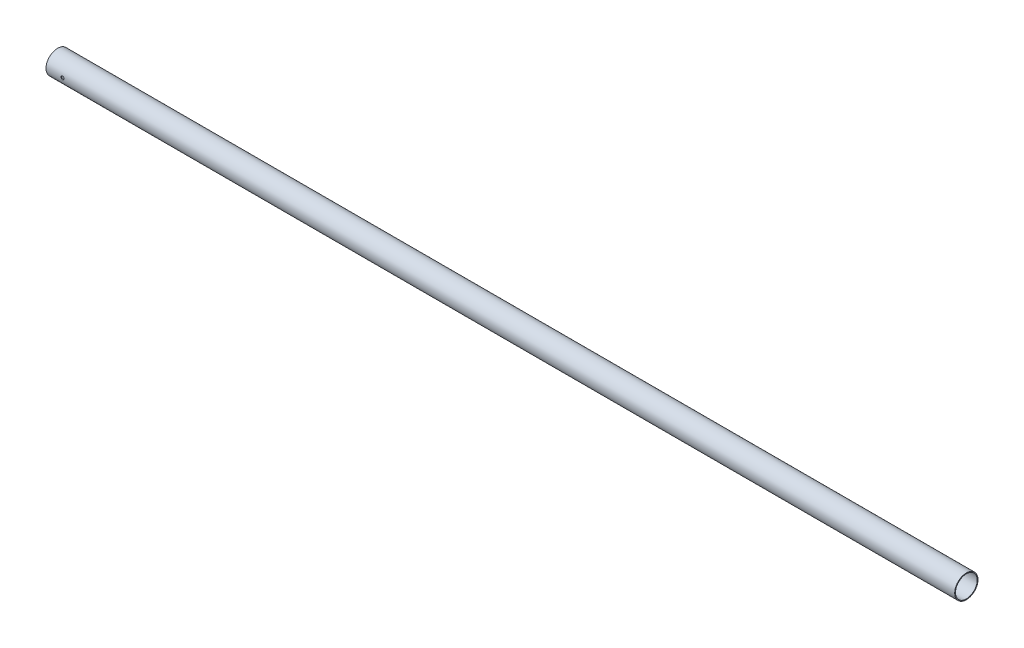
ISO-10303-21;
HEADER;
FILE_DESCRIPTION(('STEP AP214'),'2;1');
FILE_NAME('part.step','',(''),(''),'','','');
FILE_SCHEMA(('AUTOMOTIVE_DESIGN { 1 0 10303 214 1 1 1 1 }'));
ENDSEC;
DATA;
#1=APPLICATION_CONTEXT('core data for automotive mechanical design processes');
#2=APPLICATION_PROTOCOL_DEFINITION('international standard','automotive_design',2000,#1);
#3=PRODUCT_CONTEXT('',#1,'mechanical');
#4=PRODUCT('Part','Part','',(#3));
#5=PRODUCT_RELATED_PRODUCT_CATEGORY('part','',(#4));
#6=PRODUCT_DEFINITION_FORMATION('','',#4);
#7=PRODUCT_DEFINITION_CONTEXT('part definition',#1,'design');
#8=PRODUCT_DEFINITION('design','',#6,#7);
#9=PRODUCT_DEFINITION_SHAPE('','',#8);
#10=(LENGTH_UNIT() NAMED_UNIT(*) SI_UNIT(.MILLI.,.METRE.));
#11=(NAMED_UNIT(*) PLANE_ANGLE_UNIT() SI_UNIT($,.RADIAN.));
#12=(NAMED_UNIT(*) SI_UNIT($,.STERADIAN.) SOLID_ANGLE_UNIT());
#13=UNCERTAINTY_MEASURE_WITH_UNIT(LENGTH_MEASURE(1.E-05),#10,'distance_accuracy_value','');
#14=(GEOMETRIC_REPRESENTATION_CONTEXT(3) GLOBAL_UNCERTAINTY_ASSIGNED_CONTEXT((#13)) GLOBAL_UNIT_ASSIGNED_CONTEXT((#10,
#11,#12)) REPRESENTATION_CONTEXT('',''));
#15=CARTESIAN_POINT('',(0.,0.,0.));
#16=DIRECTION('',(0.,0.,1.));
#17=DIRECTION('',(1.,0.,0.));
#18=AXIS2_PLACEMENT_3D('',#15,#16,#17);
#19=CARTESIAN_POINT('',(991.014,0.,0.));
#20=DIRECTION('',(1.,0.,0.));
#21=DIRECTION('',(0.,0.,-1.));
#22=AXIS2_PLACEMENT_3D('',#19,#20,#21);
#23=PLANE('',#22);
#24=CARTESIAN_POINT('',(991.014,0.,0.));
#25=DIRECTION('',(1.,0.,0.));
#26=DIRECTION('',(0.,0.,-1.));
#27=AXIS2_PLACEMENT_3D('',#24,#25,#26);
#28=CIRCLE('',#27,12.7);
#29=CARTESIAN_POINT('',(991.014,0.,-12.7));
#30=VERTEX_POINT('',#29);
#31=EDGE_CURVE('E10',#30,#30,#28,.T.);
#32=ORIENTED_EDGE('',*,*,#31,.T.);
#33=EDGE_LOOP('',(#32));
#34=FACE_BOUND('',#33,.T.);
#35=CARTESIAN_POINT('',(991.014,0.,0.));
#36=DIRECTION('',(1.,0.,0.));
#37=DIRECTION('',(0.,0.,-1.));
#38=AXIS2_PLACEMENT_3D('',#35,#36,#37);
#39=CIRCLE('',#38,11.811);
#40=CARTESIAN_POINT('',(991.014,0.,-11.811));
#41=VERTEX_POINT('',#40);
#42=EDGE_CURVE('E56',#41,#41,#39,.T.);
#43=ORIENTED_EDGE('',*,*,#42,.F.);
#44=EDGE_LOOP('',(#43));
#45=FACE_BOUND('',#44,.T.);
#46=ADVANCED_FACE('F37',(#34,#45),#23,.T.);
#47=CARTESIAN_POINT('',(0.,0.,0.));
#48=DIRECTION('',(1.,0.,0.));
#49=DIRECTION('',(0.,0.,-1.));
#50=AXIS2_PLACEMENT_3D('',#47,#48,#49);
#51=PLANE('',#50);
#52=CARTESIAN_POINT('',(0.,0.,0.));
#53=DIRECTION('',(1.,0.,0.));
#54=DIRECTION('',(0.,0.,-1.));
#55=AXIS2_PLACEMENT_3D('',#52,#53,#54);
#56=CIRCLE('',#55,12.7);
#57=CARTESIAN_POINT('',(0.,0.,-12.7));
#58=VERTEX_POINT('',#57);
#59=EDGE_CURVE('E51',#58,#58,#56,.T.);
#60=ORIENTED_EDGE('',*,*,#59,.F.);
#61=EDGE_LOOP('',(#60));
#62=FACE_BOUND('',#61,.T.);
#63=CARTESIAN_POINT('',(0.,0.,0.));
#64=DIRECTION('',(1.,0.,0.));
#65=DIRECTION('',(0.,0.,-1.));
#66=AXIS2_PLACEMENT_3D('',#63,#64,#65);
#67=CIRCLE('',#66,11.811);
#68=CARTESIAN_POINT('',(0.,0.,-11.811));
#69=VERTEX_POINT('',#68);
#70=EDGE_CURVE('E59',#69,#69,#67,.T.);
#71=ORIENTED_EDGE('',*,*,#70,.T.);
#72=EDGE_LOOP('',(#71));
#73=FACE_BOUND('',#72,.T.);
#74=ADVANCED_FACE('F95',(#62,#73),#51,.F.);
#75=CARTESIAN_POINT('',(991.014,0.,0.));
#76=DIRECTION('',(-1.,0.,0.));
#77=DIRECTION('',(0.,0.,1.));
#78=AXIS2_PLACEMENT_3D('',#75,#76,#77);
#79=CYLINDRICAL_SURFACE('',#78,12.7);
#80=CARTESIAN_POINT('',(19.7,0.,-12.7));
#81=CARTESIAN_POINT('',(19.6999959992179,0.0950339668840666,-12.6999985995786));
#82=CARTESIAN_POINT('',(19.6920041882555,0.19012590693117,-12.69892205577));
#83=CARTESIAN_POINT('',(19.6602516928035,0.377659735515664,-12.6947310786922));
#84=CARTESIAN_POINT('',(19.6364749137547,0.470098818704447,-12.6916145654891));
#85=CARTESIAN_POINT('',(19.5738689603469,0.649585162895937,-12.6836944529743));
#86=CARTESIAN_POINT('',(19.5350503362114,0.736636153540407,-12.6788920363625));
#87=CARTESIAN_POINT('',(19.4434866282167,0.902972809326937,-12.668133083874));
#88=CARTESIAN_POINT('',(19.3907437804094,0.98225971848077,-12.6621767333452));
#89=CARTESIAN_POINT('',(19.2724752538047,1.13133074623819,-12.6497322350832));
#90=CARTESIAN_POINT('',(19.2068795471188,1.20105907920494,-12.6432412923369));
#91=CARTESIAN_POINT('',(19.0649178381758,1.32855287527093,-12.6304814917944));
#92=CARTESIAN_POINT('',(18.9885512647912,1.38631770360164,-12.6242126457971));
#93=CARTESIAN_POINT('',(18.8268487301552,1.48845585085959,-12.6125794864754));
#94=CARTESIAN_POINT('',(18.7414790965265,1.53277630674079,-12.6072187794791));
#95=CARTESIAN_POINT('',(18.5644244545483,1.60642994888796,-12.5980462279763));
#96=CARTESIAN_POINT('',(18.4727397204773,1.63576378559042,-12.5942343162519));
#97=CARTESIAN_POINT('',(18.2862392993217,1.67844067068208,-12.5886179602665));
#98=CARTESIAN_POINT('',(18.19144564102,1.69187839487359,-12.5868016351371));
#99=CARTESIAN_POINT('',(18.0009326732876,1.70267468090193,-12.5853458584028));
#100=CARTESIAN_POINT('',(17.9052134065726,1.70003398123825,-12.5857063068164));
#101=CARTESIAN_POINT('',(17.7162291334578,1.67882597900675,-12.5885524791077));
#102=CARTESIAN_POINT('',(17.6229521402506,1.66036334859318,-12.591024234991));
#103=CARTESIAN_POINT('',(17.4408322087313,1.60819906549934,-12.5977927233188));
#104=CARTESIAN_POINT('',(17.3519893722998,1.57449706285331,-12.6020894976741));
#105=CARTESIAN_POINT('',(17.180936742358,1.4926994268841,-12.6120395901206));
#106=CARTESIAN_POINT('',(17.0987487727502,1.44455869286377,-12.6176971476118));
#107=CARTESIAN_POINT('',(16.9435781710446,1.33528234667655,-12.6297281429156));
#108=CARTESIAN_POINT('',(16.8705960216702,1.27414605351568,-12.6361016182354));
#109=CARTESIAN_POINT('',(16.7353015027677,1.14003577368446,-12.6489082931571));
#110=CARTESIAN_POINT('',(16.673078463414,1.06697163981454,-12.655341565124));
#111=CARTESIAN_POINT('',(16.5617652939802,0.911389033566232,-12.6674957373912));
#112=CARTESIAN_POINT('',(16.5126752022542,0.828870533577836,-12.6732166356108));
#113=CARTESIAN_POINT('',(16.4290198450538,0.656649852468908,-12.6833057832175));
#114=CARTESIAN_POINT('',(16.3944606061958,0.566944709042034,-12.6876734711684));
#115=CARTESIAN_POINT('',(16.3409211232213,0.382932939657379,-12.6945591425037));
#116=CARTESIAN_POINT('',(16.3219400419676,0.288626561248753,-12.6970772252812));
#117=CARTESIAN_POINT('',(16.3002124588233,0.0988612499416711,-12.6999669678248));
#118=CARTESIAN_POINT('',(16.2973429834856,0.00341663518550021,-12.7003548857848));
#119=CARTESIAN_POINT('',(16.3075949092041,-0.186592199942903,-12.6989846078418));
#120=CARTESIAN_POINT('',(16.3207159184645,-0.281156441828657,-12.6972264645213));
#121=CARTESIAN_POINT('',(16.3624741566565,-0.466354124240493,-12.6917717046385));
#122=CARTESIAN_POINT('',(16.3910523228938,-0.557001118115943,-12.688082468612));
#123=CARTESIAN_POINT('',(16.4628519475053,-0.73221634230603,-12.6791782889493));
#124=CARTESIAN_POINT('',(16.5060739685466,-0.816784338893335,-12.6739632866891));
#125=CARTESIAN_POINT('',(16.6062288937945,-0.977987387725022,-12.6625478144558));
#126=CARTESIAN_POINT('',(16.6632408321252,-1.05457293223038,-12.6563417366426));
#127=CARTESIAN_POINT('',(16.7892460195627,-1.19713236803618,-12.6436547701942));
#128=CARTESIAN_POINT('',(16.8582398170769,-1.26310577335476,-12.6371738689908));
#129=CARTESIAN_POINT('',(17.006793907203,-1.38300824178855,-12.6246170593813));
#130=CARTESIAN_POINT('',(17.0864205322927,-1.43685547455966,-12.6185440858799));
#131=CARTESIAN_POINT('',(17.2536601808562,-1.53041060066335,-12.607540272347));
#132=CARTESIAN_POINT('',(17.3412730247706,-1.57011881179429,-12.6026094066456));
#133=CARTESIAN_POINT('',(17.5217407781579,-1.63413811770883,-12.5944685488549));
#134=CARTESIAN_POINT('',(17.6145794495971,-1.65849431867464,-12.5912535197242));
#135=CARTESIAN_POINT('',(17.8030751011367,-1.69126295280576,-12.5868942723901));
#136=CARTESIAN_POINT('',(17.8987319289187,-1.69967624606926,-12.5857499424755));
#137=CARTESIAN_POINT('',(18.0893339863174,-1.70030289341542,-12.5856652315807));
#138=CARTESIAN_POINT('',(18.1842788108431,-1.69264483293011,-12.5867073569543));
#139=CARTESIAN_POINT('',(18.3715183834309,-1.66161953930401,-12.5908403897388));
#140=CARTESIAN_POINT('',(18.463813132574,-1.6382523125708,-12.593931296314));
#141=CARTESIAN_POINT('',(18.6431094231047,-1.57651400196732,-12.601807977421));
#142=CARTESIAN_POINT('',(18.7301134601321,-1.53815005652329,-12.6065929454788));
#143=CARTESIAN_POINT('',(18.8964702488958,-1.44751995832389,-12.6173198076024));
#144=CARTESIAN_POINT('',(18.9758228494986,-1.39525353103899,-12.6232617245136));
#145=CARTESIAN_POINT('',(19.1252803268485,-1.27782820548912,-12.6356898389152));
#146=CARTESIAN_POINT('',(19.1953097247303,-1.21257363471889,-12.6421798563099));
#147=CARTESIAN_POINT('',(19.3234721297044,-1.07122538659935,-12.6549397826002));
#148=CARTESIAN_POINT('',(19.3816023430478,-0.995129170891949,-12.6612096395197));
#149=CARTESIAN_POINT('',(19.48453599194,-0.833873629090083,-12.6728533752327));
#150=CARTESIAN_POINT('',(19.5292802962862,-0.748676282109283,-12.6782232337741));
#151=CARTESIAN_POINT('',(19.6037608892282,-0.571949691102355,-12.6874217828558));
#152=CARTESIAN_POINT('',(19.63351323197,-0.48042734019212,-12.6912521210983));
#153=CARTESIAN_POINT('',(19.6701668573837,-0.32370968364222,-12.6960329483211));
#154=CARTESIAN_POINT('',(19.6813378724772,-0.259496143043121,-12.6975132154494));
#155=CARTESIAN_POINT('',(19.6962557812401,-0.130197467850004,-12.6994972166818));
#156=CARTESIAN_POINT('',(19.7000027411282,-0.0651123410353023,-12.700000959496));
#157=CARTESIAN_POINT('',(19.7,0.,-12.7));
#158=B_SPLINE_CURVE_WITH_KNOTS('',3,(#80,#81,#82,#83,#84,#85,#86,#87,#88,#89,#90,#91,#92,#93,
#94,#95,#96,#97,#98,#99,#100,#101,#102,#103,#104,#105,#106,#107,#108,#109,#110,#111,#112,#113,
#114,#115,#116,#117,#118,#119,#120,#121,#122,#123,#124,#125,#126,#127,#128,#129,#130,#131,#132,
#133,#134,#135,#136,#137,#138,#139,#140,#141,#142,#143,#144,#145,#146,#147,#148,#149,#150,#151,
#152,#153,#154,#155,#156,#157),.UNSPECIFIED.,.T.,.F.,(4,2,2,2,2,2,2,2,2,2,2,2,2,2,2,2,2,2,2,2,2,
2,2,2,2,2,2,2,2,2,2,2,2,2,2,2,2,2,4),(0.,0.284864035698537,0.570018969485685,0.854974258980744,
1.13988381611715,1.42639115813427,1.71291369797885,2.00054865692536,2.28817113112365,
2.57407178612564,2.85995930949888,3.14396997780514,3.42798716862777,3.71290091962872,
3.99782960437716,4.28502088941334,4.57221301316844,4.85952413156251,5.14681980945722,
5.43191966224501,5.71701252971187,6.00102365831222,6.28504570083371,6.57073582475008,
6.8564390280948,7.14401601038438,7.431586528488,7.71830813986012,8.0050142825509,
8.28943526420126,8.57385612983972,8.85814177590334,9.14243303611576,9.42890156631939,
9.71543727805735,10.0032206578249,10.290695206261,10.4858709975236,10.6810450479105),.UNSPECIFIED.);
#159=CARTESIAN_POINT('',(19.7,0.,-12.7));
#160=VERTEX_POINT('',#159);
#161=EDGE_CURVE('E84',#160,#160,#158,.T.);
#162=ORIENTED_EDGE('',*,*,#161,.T.);
#163=EDGE_LOOP('',(#162));
#164=FACE_BOUND('',#163,.T.);
#165=CARTESIAN_POINT('',(19.7,0.,12.7));
#166=CARTESIAN_POINT('',(19.6999959992179,-0.0950339668840666,12.6999985995786));
#167=CARTESIAN_POINT('',(19.6920041882555,-0.19012590693117,12.69892205577));
#168=CARTESIAN_POINT('',(19.6602516928035,-0.377659735515664,12.6947310786922));
#169=CARTESIAN_POINT('',(19.6364749137547,-0.470098818704447,12.6916145654891));
#170=CARTESIAN_POINT('',(19.5738689603469,-0.649585162895937,12.6836944529743));
#171=CARTESIAN_POINT('',(19.5350503362114,-0.736636153540407,12.6788920363625));
#172=CARTESIAN_POINT('',(19.4434866282167,-0.902972809326937,12.668133083874));
#173=CARTESIAN_POINT('',(19.3907437804094,-0.98225971848077,12.6621767333452));
#174=CARTESIAN_POINT('',(19.2724752538047,-1.13133074623819,12.6497322350832));
#175=CARTESIAN_POINT('',(19.2068795471188,-1.20105907920494,12.6432412923369));
#176=CARTESIAN_POINT('',(19.0649178381758,-1.32855287527093,12.6304814917944));
#177=CARTESIAN_POINT('',(18.9885512647912,-1.38631770360164,12.6242126457971));
#178=CARTESIAN_POINT('',(18.8268487301552,-1.48845585085959,12.6125794864754));
#179=CARTESIAN_POINT('',(18.7414790965265,-1.53277630674079,12.6072187794791));
#180=CARTESIAN_POINT('',(18.5644244545483,-1.60642994888796,12.5980462279763));
#181=CARTESIAN_POINT('',(18.4727397204773,-1.63576378559042,12.5942343162519));
#182=CARTESIAN_POINT('',(18.2862392993217,-1.67844067068208,12.5886179602665));
#183=CARTESIAN_POINT('',(18.19144564102,-1.69187839487359,12.5868016351371));
#184=CARTESIAN_POINT('',(18.0009326732876,-1.70267468090193,12.5853458584028));
#185=CARTESIAN_POINT('',(17.9052134065726,-1.70003398123825,12.5857063068164));
#186=CARTESIAN_POINT('',(17.7162291334578,-1.67882597900675,12.5885524791077));
#187=CARTESIAN_POINT('',(17.6229521402506,-1.66036334859318,12.591024234991));
#188=CARTESIAN_POINT('',(17.4408322087313,-1.60819906549934,12.5977927233188));
#189=CARTESIAN_POINT('',(17.3519893722998,-1.57449706285331,12.6020894976741));
#190=CARTESIAN_POINT('',(17.180936742358,-1.4926994268841,12.6120395901206));
#191=CARTESIAN_POINT('',(17.0987487727502,-1.44455869286377,12.6176971476118));
#192=CARTESIAN_POINT('',(16.9435781710446,-1.33528234667655,12.6297281429156));
#193=CARTESIAN_POINT('',(16.8705960216702,-1.27414605351568,12.6361016182354));
#194=CARTESIAN_POINT('',(16.7353015027677,-1.14003577368446,12.6489082931571));
#195=CARTESIAN_POINT('',(16.673078463414,-1.06697163981454,12.655341565124));
#196=CARTESIAN_POINT('',(16.5617652939802,-0.911389033566232,12.6674957373912));
#197=CARTESIAN_POINT('',(16.5126752022542,-0.828870533577836,12.6732166356108));
#198=CARTESIAN_POINT('',(16.4290198450538,-0.656649852468908,12.6833057832175));
#199=CARTESIAN_POINT('',(16.3944606061958,-0.566944709042034,12.6876734711684));
#200=CARTESIAN_POINT('',(16.3409211232213,-0.382932939657379,12.6945591425037));
#201=CARTESIAN_POINT('',(16.3219400419676,-0.288626561248753,12.6970772252812));
#202=CARTESIAN_POINT('',(16.3002124588233,-0.0988612499416711,12.6999669678248));
#203=CARTESIAN_POINT('',(16.2973429834856,-0.00341663518550021,12.7003548857848));
#204=CARTESIAN_POINT('',(16.3075949092041,0.186592199942903,12.6989846078418));
#205=CARTESIAN_POINT('',(16.3207159184645,0.281156441828657,12.6972264645213));
#206=CARTESIAN_POINT('',(16.3624741566565,0.466354124240493,12.6917717046385));
#207=CARTESIAN_POINT('',(16.3910523228938,0.557001118115943,12.688082468612));
#208=CARTESIAN_POINT('',(16.4628519475053,0.73221634230603,12.6791782889493));
#209=CARTESIAN_POINT('',(16.5060739685466,0.816784338893335,12.6739632866891));
#210=CARTESIAN_POINT('',(16.6062288937945,0.977987387725022,12.6625478144558));
#211=CARTESIAN_POINT('',(16.6632408321252,1.05457293223038,12.6563417366426));
#212=CARTESIAN_POINT('',(16.7892460195627,1.19713236803618,12.6436547701942));
#213=CARTESIAN_POINT('',(16.8582398170769,1.26310577335476,12.6371738689908));
#214=CARTESIAN_POINT('',(17.006793907203,1.38300824178855,12.6246170593813));
#215=CARTESIAN_POINT('',(17.0864205322927,1.43685547455966,12.6185440858799));
#216=CARTESIAN_POINT('',(17.2536601808562,1.53041060066335,12.607540272347));
#217=CARTESIAN_POINT('',(17.3412730247706,1.57011881179429,12.6026094066456));
#218=CARTESIAN_POINT('',(17.5217407781579,1.63413811770883,12.5944685488549));
#219=CARTESIAN_POINT('',(17.6145794495971,1.65849431867464,12.5912535197242));
#220=CARTESIAN_POINT('',(17.8030751011367,1.69126295280576,12.5868942723901));
#221=CARTESIAN_POINT('',(17.8987319289187,1.69967624606926,12.5857499424755));
#222=CARTESIAN_POINT('',(18.0893339863174,1.70030289341542,12.5856652315807));
#223=CARTESIAN_POINT('',(18.1842788108431,1.69264483293011,12.5867073569543));
#224=CARTESIAN_POINT('',(18.3715183834309,1.66161953930401,12.5908403897388));
#225=CARTESIAN_POINT('',(18.463813132574,1.6382523125708,12.593931296314));
#226=CARTESIAN_POINT('',(18.6431094231047,1.57651400196732,12.601807977421));
#227=CARTESIAN_POINT('',(18.7301134601321,1.53815005652329,12.6065929454788));
#228=CARTESIAN_POINT('',(18.8964702488958,1.44751995832389,12.6173198076024));
#229=CARTESIAN_POINT('',(18.9758228494986,1.39525353103899,12.6232617245136));
#230=CARTESIAN_POINT('',(19.1252803268485,1.27782820548912,12.6356898389152));
#231=CARTESIAN_POINT('',(19.1953097247303,1.21257363471889,12.6421798563099));
#232=CARTESIAN_POINT('',(19.3234721297044,1.07122538659935,12.6549397826002));
#233=CARTESIAN_POINT('',(19.3816023430478,0.995129170891949,12.6612096395197));
#234=CARTESIAN_POINT('',(19.48453599194,0.833873629090083,12.6728533752327));
#235=CARTESIAN_POINT('',(19.5292802962862,0.748676282109283,12.6782232337741));
#236=CARTESIAN_POINT('',(19.6037608892282,0.571949691102355,12.6874217828558));
#237=CARTESIAN_POINT('',(19.63351323197,0.48042734019212,12.6912521210983));
#238=CARTESIAN_POINT('',(19.6701668573837,0.32370968364222,12.6960329483211));
#239=CARTESIAN_POINT('',(19.6813378724772,0.259496143043121,12.6975132154494));
#240=CARTESIAN_POINT('',(19.6962557812401,0.130197467850004,12.6994972166818));
#241=CARTESIAN_POINT('',(19.7000027411282,0.0651123410353023,12.700000959496));
#242=CARTESIAN_POINT('',(19.7,0.,12.7));
#243=B_SPLINE_CURVE_WITH_KNOTS('',3,(#165,#166,#167,#168,#169,#170,#171,#172,#173,#174,#175,
#176,#177,#178,#179,#180,#181,#182,#183,#184,#185,#186,#187,#188,#189,#190,#191,#192,#193,#194,
#195,#196,#197,#198,#199,#200,#201,#202,#203,#204,#205,#206,#207,#208,#209,#210,#211,#212,#213,
#214,#215,#216,#217,#218,#219,#220,#221,#222,#223,#224,#225,#226,#227,#228,#229,#230,#231,#232,
#233,#234,#235,#236,#237,#238,#239,#240,#241,#242),.UNSPECIFIED.,.T.,.F.,(4,2,2,2,2,2,2,2,2,2,2,
2,2,2,2,2,2,2,2,2,2,2,2,2,2,2,2,2,2,2,2,2,2,2,2,2,2,2,4),(0.,0.284864035698537,
0.570018969485685,0.854974258980744,1.13988381611715,1.42639115813427,1.71291369797885,
2.00054865692536,2.28817113112365,2.57407178612564,2.85995930949888,3.14396997780514,
3.42798716862777,3.71290091962872,3.99782960437716,4.28502088941334,4.57221301316844,
4.85952413156251,5.14681980945722,5.43191966224501,5.71701252971187,6.00102365831222,
6.28504570083371,6.57073582475008,6.8564390280948,7.14401601038438,7.431586528488,
7.71830813986012,8.0050142825509,8.28943526420126,8.57385612983972,8.85814177590334,
9.14243303611576,9.42890156631939,9.71543727805735,10.0032206578249,10.290695206261,
10.4858709975236,10.6810450479105),.UNSPECIFIED.);
#244=CARTESIAN_POINT('',(19.7,0.,12.7));
#245=VERTEX_POINT('',#244);
#246=EDGE_CURVE('E79',#245,#245,#243,.T.);
#247=ORIENTED_EDGE('',*,*,#246,.T.);
#248=EDGE_LOOP('',(#247));
#249=FACE_BOUND('',#248,.T.);
#250=ORIENTED_EDGE('',*,*,#31,.F.);
#251=EDGE_LOOP('',(#250));
#252=FACE_BOUND('',#251,.T.);
#253=ORIENTED_EDGE('',*,*,#59,.T.);
#254=EDGE_LOOP('',(#253));
#255=FACE_BOUND('',#254,.T.);
#256=ADVANCED_FACE('F39',(#164,#249,#252,#255),#79,.T.);
#257=CARTESIAN_POINT('',(991.014,0.,0.));
#258=DIRECTION('',(-1.,0.,0.));
#259=DIRECTION('',(0.,0.,1.));
#260=AXIS2_PLACEMENT_3D('',#257,#258,#259);
#261=CYLINDRICAL_SURFACE('',#260,11.811);
#262=CARTESIAN_POINT('',(19.7,0.,11.811));
#263=CARTESIAN_POINT('',(19.6999960506825,-0.0949633365740569,11.8109985219341));
#264=CARTESIAN_POINT('',(19.6920160552475,-0.189982877219708,11.8098426802892));
#265=CARTESIAN_POINT('',(19.6603132495635,-0.377369093460647,11.8053430227354));
#266=CARTESIAN_POINT('',(19.6365748230488,-0.469733042599291,11.8019970364864));
#267=CARTESIAN_POINT('',(19.5740765633508,-0.649068854078001,11.7934933444568));
#268=CARTESIAN_POINT('',(19.5353277640509,-0.736044622835741,11.7883369697238));
#269=CARTESIAN_POINT('',(19.4439349591902,-0.902245224987233,11.7767832373071));
#270=CARTESIAN_POINT('',(19.3912930000878,-0.981471197569839,11.7703860624296));
#271=CARTESIAN_POINT('',(19.2732030959118,-1.13050913396133,11.7570112315331));
#272=CARTESIAN_POINT('',(19.2076747326008,-1.20025707309759,11.7500300971524));
#273=CARTESIAN_POINT('',(19.0658451220361,-1.32780690367162,11.7363015989273));
#274=CARTESIAN_POINT('',(18.9895432747015,-1.3856081292376,11.7295542481307));
#275=CARTESIAN_POINT('',(18.8279058995033,-1.48787036847237,11.7170234438705));
#276=CARTESIAN_POINT('',(18.7425311085024,-1.53226992046287,11.7112444838184));
#277=CARTESIAN_POINT('',(18.5654391933575,-1.60607577266456,11.7013519190154));
#278=CARTESIAN_POINT('',(18.473722387587,-1.6354828248897,11.6972382307377));
#279=CARTESIAN_POINT('',(18.287221238183,-1.67827112473676,11.6911759676832));
#280=CARTESIAN_POINT('',(18.1924624498631,-1.69176163203234,11.6892126384495));
#281=CARTESIAN_POINT('',(18.0020072490258,-1.70267227309994,11.6876285186793));
#282=CARTESIAN_POINT('',(17.9063108864093,-1.70009325756097,11.6880076041401));
#283=CARTESIAN_POINT('',(17.7174661214855,-1.67902745255736,11.691051985365));
#284=CARTESIAN_POINT('',(17.6243038621422,-1.66066200271549,11.693699842128));
#285=CARTESIAN_POINT('',(17.4423972032276,-1.60873443984952,11.7009561911545));
#286=CARTESIAN_POINT('',(17.3536529196023,-1.57517192822512,11.7055647348442));
#287=CARTESIAN_POINT('',(17.1827301433947,-1.49367567025867,11.716242590323));
#288=CARTESIAN_POINT('',(17.1005766614923,-1.44569018392096,11.7223171454555));
#289=CARTESIAN_POINT('',(16.9454419332378,-1.33674699740009,11.7352387233349));
#290=CARTESIAN_POINT('',(16.8724612422249,-1.27578851240678,11.7420857928038));
#291=CARTESIAN_POINT('',(16.7370402316378,-1.14196200077654,11.7558580883074));
#292=CARTESIAN_POINT('',(16.6747030446548,-1.06898958032788,11.7627834539105));
#293=CARTESIAN_POINT('',(16.5631449214485,-0.913563355066816,11.7758734292219));
#294=CARTESIAN_POINT('',(16.5139240347357,-0.831109514466287,11.7820380360584));
#295=CARTESIAN_POINT('',(16.4299917699311,-0.658974172014321,11.7929176287989));
#296=CARTESIAN_POINT('',(16.3952879602131,-0.569288929110842,11.7976318582212));
#297=CARTESIAN_POINT('',(16.3414625975828,-0.385280648300725,11.8050730910877));
#298=CARTESIAN_POINT('',(16.3223400754528,-0.290957899252374,11.8078002181366));
#299=CARTESIAN_POINT('',(16.3003563446372,-0.101242607019846,11.8109436834614));
#300=CARTESIAN_POINT('',(16.2973532771797,-0.00586682355212268,11.811380179601));
#301=CARTESIAN_POINT('',(16.3073177263595,0.184026880290368,11.8099479582115));
#302=CARTESIAN_POINT('',(16.3202847888428,0.278544824983108,11.8080793062356));
#303=CARTESIAN_POINT('',(16.3617034710758,0.463613016155271,11.8022592312506));
#304=CARTESIAN_POINT('',(16.3900863585206,0.554178960795697,11.7983170556067));
#305=CARTESIAN_POINT('',(16.4614587888451,0.729266418257608,11.7887906933605));
#306=CARTESIAN_POINT('',(16.5044489700626,0.813787666730863,11.7832064350008));
#307=CARTESIAN_POINT('',(16.6041511523142,0.975012812185227,11.7709668100829));
#308=CARTESIAN_POINT('',(16.6609536014292,1.05166023789249,11.7643044843033));
#309=CARTESIAN_POINT('',(16.7865414587591,1.19438484899554,11.750672986933));
#310=CARTESIAN_POINT('',(16.8553275054601,1.26046147081892,11.7437037990075));
#311=CARTESIAN_POINT('',(17.003559830618,1.38068166669794,11.7301805683755));
#312=CARTESIAN_POINT('',(17.0830833909513,1.43473041373841,11.7236300961746));
#313=CARTESIAN_POINT('',(17.2501637244195,1.52870253161708,11.7117480571151));
#314=CARTESIAN_POINT('',(17.3377202942297,1.56862625985151,11.7064164594173));
#315=CARTESIAN_POINT('',(17.5180924831322,1.6330663713551,11.6976013208194));
#316=CARTESIAN_POINT('',(17.6108896352666,1.6576335753935,11.6941116901567));
#317=CARTESIAN_POINT('',(17.7993464367159,1.69082554924417,11.6893590853919));
#318=CARTESIAN_POINT('',(17.8950059049259,1.6994513255461,11.6880959707151));
#319=CARTESIAN_POINT('',(18.0855272553967,1.70049305790303,11.6879443741982));
#320=CARTESIAN_POINT('',(18.180388339111,1.69305807386296,11.6890340560121));
#321=CARTESIAN_POINT('',(18.3674964573984,1.66250778747196,11.6934179490026));
#322=CARTESIAN_POINT('',(18.4597434948784,1.63939250255821,11.6967121577278));
#323=CARTESIAN_POINT('',(18.6389692279335,1.57818894246534,11.7051265233326));
#324=CARTESIAN_POINT('',(18.7259512568652,1.54011025772638,11.7102455104686));
#325=CARTESIAN_POINT('',(18.8923159801059,1.45007554750406,11.7217341938223));
#326=CARTESIAN_POINT('',(18.9716984583745,1.39811912766296,11.7281039255805));
#327=CARTESIAN_POINT('',(19.1213693369344,1.2812591410815,11.7414469050402));
#328=CARTESIAN_POINT('',(19.1915709499774,1.2162449615365,11.7484249990409));
#329=CARTESIAN_POINT('',(19.3201216216477,1.07534846350219,11.7621573750622));
#330=CARTESIAN_POINT('',(19.3784679127108,0.999463614343984,11.7689116045154));
#331=CARTESIAN_POINT('',(19.4819122735376,0.83853133913813,11.7814739265501));
#332=CARTESIAN_POINT('',(19.5269419649513,0.753439585305897,11.787277069854));
#333=CARTESIAN_POINT('',(19.6020042533168,0.576859476383486,11.7972345527272));
#334=CARTESIAN_POINT('',(19.632052581816,0.485377946647713,11.801390620903));
#335=CARTESIAN_POINT('',(19.6693842114288,0.327890845246801,11.8066231007302));
#336=CARTESIAN_POINT('',(19.680847861636,0.262863239839553,11.8082561218876));
#337=CARTESIAN_POINT('',(19.6961570856845,0.131899455682025,11.8104450789484));
#338=CARTESIAN_POINT('',(19.7000027432689,0.0659632869274253,11.8110010266919));
#339=CARTESIAN_POINT('',(19.7,0.,11.811));
#340=B_SPLINE_CURVE_WITH_KNOTS('',3,(#262,#263,#264,#265,#266,#267,#268,#269,#270,#271,#272,
#273,#274,#275,#276,#277,#278,#279,#280,#281,#282,#283,#284,#285,#286,#287,#288,#289,#290,#291,
#292,#293,#294,#295,#296,#297,#298,#299,#300,#301,#302,#303,#304,#305,#306,#307,#308,#309,#310,
#311,#312,#313,#314,#315,#316,#317,#318,#319,#320,#321,#322,#323,#324,#325,#326,#327,#328,#329,
#330,#331,#332,#333,#334,#335,#336,#337,#338,#339),.UNSPECIFIED.,.T.,.F.,(4,2,2,2,2,2,2,2,2,2,2,
2,2,2,2,2,2,2,2,2,2,2,2,2,2,2,2,2,2,2,2,2,2,2,2,2,2,2,4),(0.,0.284648997756756,
0.569580498473071,0.854302946868714,1.13898347911696,1.42550042768716,1.71203334149623,
1.99986103307518,2.2876742859853,2.5735001221883,2.85931082746098,3.14294414558129,
3.42658490348702,3.711255571745,3.9959434662417,4.28325010816804,4.570557834584,
4.85801516070151,5.1454546044716,5.43036024797864,5.71525778960857,5.9988954041135,
6.28254541515722,6.56810541339531,6.85368063092428,7.14143326657706,7.42917862088989,
7.71596659993671,8.00273647150893,8.28685627476276,8.57097576206354,8.8549134458757,
9.13885919908395,9.4253202309991,9.71184805913824,9.99982258064417,10.287494067183,
10.4852186901637,10.6829411395849),.UNSPECIFIED.);
#341=CARTESIAN_POINT('',(19.7,0.,11.811));
#342=VERTEX_POINT('',#341);
#343=EDGE_CURVE('E42',#342,#342,#340,.T.);
#344=ORIENTED_EDGE('',*,*,#343,.F.);
#345=EDGE_LOOP('',(#344));
#346=FACE_BOUND('',#345,.T.);
#347=CARTESIAN_POINT('',(19.7,0.,-11.811));
#348=CARTESIAN_POINT('',(19.6999960506825,0.0949633365740576,-11.8109985219341));
#349=CARTESIAN_POINT('',(19.6920160552475,0.189982877219709,-11.8098426802892));
#350=CARTESIAN_POINT('',(19.6603132495635,0.377369093460649,-11.8053430227354));
#351=CARTESIAN_POINT('',(19.6365748230488,0.469733042599292,-11.8019970364864));
#352=CARTESIAN_POINT('',(19.5740765633508,0.649068854078,-11.7934933444568));
#353=CARTESIAN_POINT('',(19.5353277640509,0.736044622835739,-11.7883369697238));
#354=CARTESIAN_POINT('',(19.4439349591902,0.902245224987231,-11.7767832373071));
#355=CARTESIAN_POINT('',(19.3912930000878,0.981471197569838,-11.7703860624296));
#356=CARTESIAN_POINT('',(19.2732030959118,1.13050913396133,-11.7570112315331));
#357=CARTESIAN_POINT('',(19.2076747326008,1.20025707309759,-11.7500300971524));
#358=CARTESIAN_POINT('',(19.0658451220361,1.32780690367162,-11.7363015989273));
#359=CARTESIAN_POINT('',(18.9895432747015,1.3856081292376,-11.7295542481307));
#360=CARTESIAN_POINT('',(18.8279058995033,1.48787036847237,-11.7170234438705));
#361=CARTESIAN_POINT('',(18.7425311085024,1.53226992046287,-11.7112444838184));
#362=CARTESIAN_POINT('',(18.5654391933575,1.60607577266456,-11.7013519190154));
#363=CARTESIAN_POINT('',(18.473722387587,1.6354828248897,-11.6972382307377));
#364=CARTESIAN_POINT('',(18.287221238183,1.67827112473676,-11.6911759676832));
#365=CARTESIAN_POINT('',(18.1924624498631,1.69176163203234,-11.6892126384495));
#366=CARTESIAN_POINT('',(18.0020072490258,1.70267227309994,-11.6876285186793));
#367=CARTESIAN_POINT('',(17.9063108864093,1.70009325756097,-11.6880076041401));
#368=CARTESIAN_POINT('',(17.7174661214855,1.67902745255736,-11.691051985365));
#369=CARTESIAN_POINT('',(17.6243038621422,1.66066200271549,-11.693699842128));
#370=CARTESIAN_POINT('',(17.4423972032276,1.60873443984952,-11.7009561911545));
#371=CARTESIAN_POINT('',(17.3536529196023,1.57517192822512,-11.7055647348442));
#372=CARTESIAN_POINT('',(17.1827301433947,1.49367567025867,-11.716242590323));
#373=CARTESIAN_POINT('',(17.1005766614923,1.44569018392096,-11.7223171454555));
#374=CARTESIAN_POINT('',(16.9454419332378,1.33674699740009,-11.7352387233349));
#375=CARTESIAN_POINT('',(16.8724612422249,1.27578851240678,-11.7420857928038));
#376=CARTESIAN_POINT('',(16.7370402316378,1.14196200077654,-11.7558580883074));
#377=CARTESIAN_POINT('',(16.6747030446548,1.06898958032788,-11.7627834539105));
#378=CARTESIAN_POINT('',(16.5631449214485,0.913563355066816,-11.7758734292219));
#379=CARTESIAN_POINT('',(16.5139240347357,0.831109514466287,-11.7820380360584));
#380=CARTESIAN_POINT('',(16.4299917699311,0.658974172014321,-11.7929176287989));
#381=CARTESIAN_POINT('',(16.3952879602131,0.569288929110842,-11.7976318582212));
#382=CARTESIAN_POINT('',(16.3414625975828,0.385280648300726,-11.8050730910877));
#383=CARTESIAN_POINT('',(16.3223400754528,0.290957899252374,-11.8078002181366));
#384=CARTESIAN_POINT('',(16.3003563446372,0.101242607019846,-11.8109436834614));
#385=CARTESIAN_POINT('',(16.2973532771797,0.00586682355212304,-11.811380179601));
#386=CARTESIAN_POINT('',(16.3073177263595,-0.184026880290368,-11.8099479582115));
#387=CARTESIAN_POINT('',(16.3202847888428,-0.278544824983107,-11.8080793062356));
#388=CARTESIAN_POINT('',(16.3617034710758,-0.463613016155271,-11.8022592312506));
#389=CARTESIAN_POINT('',(16.3900863585206,-0.554178960795696,-11.7983170556067));
#390=CARTESIAN_POINT('',(16.4614587888451,-0.729266418257607,-11.7887906933605));
#391=CARTESIAN_POINT('',(16.5044489700626,-0.813787666730862,-11.7832064350008));
#392=CARTESIAN_POINT('',(16.6041511523142,-0.975012812185226,-11.770966810083));
#393=CARTESIAN_POINT('',(16.6609536014292,-1.05166023789249,-11.7643044843033));
#394=CARTESIAN_POINT('',(16.7865414587591,-1.19438484899554,-11.750672986933));
#395=CARTESIAN_POINT('',(16.8553275054601,-1.26046147081892,-11.7437037990075));
#396=CARTESIAN_POINT('',(17.003559830618,-1.38068166669794,-11.7301805683755));
#397=CARTESIAN_POINT('',(17.0830833909513,-1.43473041373841,-11.7236300961746));
#398=CARTESIAN_POINT('',(17.2501637244195,-1.52870253161708,-11.7117480571151));
#399=CARTESIAN_POINT('',(17.3377202942297,-1.56862625985151,-11.7064164594173));
#400=CARTESIAN_POINT('',(17.5180924831322,-1.6330663713551,-11.6976013208194));
#401=CARTESIAN_POINT('',(17.6108896352666,-1.6576335753935,-11.6941116901567));
#402=CARTESIAN_POINT('',(17.7993464367159,-1.69082554924417,-11.6893590853919));
#403=CARTESIAN_POINT('',(17.8950059049259,-1.6994513255461,-11.6880959707151));
#404=CARTESIAN_POINT('',(18.0855272553967,-1.70049305790303,-11.6879443741982));
#405=CARTESIAN_POINT('',(18.180388339111,-1.69305807386296,-11.6890340560121));
#406=CARTESIAN_POINT('',(18.3674964573984,-1.66250778747196,-11.6934179490026));
#407=CARTESIAN_POINT('',(18.4597434948784,-1.63939250255821,-11.6967121577278));
#408=CARTESIAN_POINT('',(18.6389692279335,-1.57818894246534,-11.7051265233326));
#409=CARTESIAN_POINT('',(18.7259512568652,-1.54011025772638,-11.7102455104686));
#410=CARTESIAN_POINT('',(18.8923159801059,-1.45007554750406,-11.7217341938223));
#411=CARTESIAN_POINT('',(18.9716984583745,-1.39811912766296,-11.7281039255805));
#412=CARTESIAN_POINT('',(19.1213693369344,-1.2812591410815,-11.7414469050402));
#413=CARTESIAN_POINT('',(19.1915709499774,-1.2162449615365,-11.7484249990409));
#414=CARTESIAN_POINT('',(19.3201216216477,-1.07534846350219,-11.7621573750622));
#415=CARTESIAN_POINT('',(19.3784679127108,-0.999463614343984,-11.7689116045154));
#416=CARTESIAN_POINT('',(19.4819122735376,-0.83853133913813,-11.7814739265501));
#417=CARTESIAN_POINT('',(19.5269419649513,-0.753439585305898,-11.787277069854));
#418=CARTESIAN_POINT('',(19.6020042533168,-0.576859476383486,-11.7972345527272));
#419=CARTESIAN_POINT('',(19.632052581816,-0.485377946647713,-11.801390620903));
#420=CARTESIAN_POINT('',(19.6693842114288,-0.327890845246802,-11.8066231007302));
#421=CARTESIAN_POINT('',(19.680847861636,-0.262863239839554,-11.8082561218876));
#422=CARTESIAN_POINT('',(19.6961570856845,-0.131899455682027,-11.8104450789484));
#423=CARTESIAN_POINT('',(19.7000027432689,-0.065963286927426,-11.8110010266919));
#424=CARTESIAN_POINT('',(19.7,0.,-11.811));
#425=B_SPLINE_CURVE_WITH_KNOTS('',3,(#347,#348,#349,#350,#351,#352,#353,#354,#355,#356,#357,
#358,#359,#360,#361,#362,#363,#364,#365,#366,#367,#368,#369,#370,#371,#372,#373,#374,#375,#376,
#377,#378,#379,#380,#381,#382,#383,#384,#385,#386,#387,#388,#389,#390,#391,#392,#393,#394,#395,
#396,#397,#398,#399,#400,#401,#402,#403,#404,#405,#406,#407,#408,#409,#410,#411,#412,#413,#414,
#415,#416,#417,#418,#419,#420,#421,#422,#423,#424),.UNSPECIFIED.,.T.,.F.,(4,2,2,2,2,2,2,2,2,2,2,
2,2,2,2,2,2,2,2,2,2,2,2,2,2,2,2,2,2,2,2,2,2,2,2,2,2,2,4),(0.,0.284648997756756,0.56958049847307,
0.85430294686871,1.13898347911695,1.42550042768716,1.71203334149623,1.99986103307517,
2.2876742859853,2.57350012218829,2.85931082746098,3.14294414558129,3.42658490348701,
3.711255571745,3.9959434662417,4.28325010816803,4.570557834584,4.85801516070151,
5.14545460447159,5.43036024797864,5.71525778960856,5.9988954041135,6.28254541515722,
6.56810541339531,6.85368063092427,7.14143326657706,7.42917862088989,7.7159665999367,
8.00273647150893,8.28685627476276,8.57097576206353,8.8549134458757,9.13885919908395,
9.4253202309991,9.71184805913824,9.99982258064417,10.287494067183,10.4852186901637,
10.6829411395849),.UNSPECIFIED.);
#426=CARTESIAN_POINT('',(19.7,0.,-11.811));
#427=VERTEX_POINT('',#426);
#428=EDGE_CURVE('E61',#427,#427,#425,.T.);
#429=ORIENTED_EDGE('',*,*,#428,.F.);
#430=EDGE_LOOP('',(#429));
#431=FACE_BOUND('',#430,.T.);
#432=ORIENTED_EDGE('',*,*,#42,.T.);
#433=EDGE_LOOP('',(#432));
#434=FACE_BOUND('',#433,.T.);
#435=ORIENTED_EDGE('',*,*,#70,.F.);
#436=EDGE_LOOP('',(#435));
#437=FACE_BOUND('',#436,.T.);
#438=ADVANCED_FACE('F66',(#346,#431,#434,#437),#261,.F.);
#439=CARTESIAN_POINT('',(18.,0.,-12.7));
#440=DIRECTION('',(0.,0.,1.));
#441=DIRECTION('',(1.,0.,0.));
#442=AXIS2_PLACEMENT_3D('',#439,#440,#441);
#443=CYLINDRICAL_SURFACE('',#442,1.7);
#444=ORIENTED_EDGE('',*,*,#428,.T.);
#445=EDGE_LOOP('',(#444));
#446=FACE_BOUND('',#445,.T.);
#447=ORIENTED_EDGE('',*,*,#161,.F.);
#448=EDGE_LOOP('',(#447));
#449=FACE_BOUND('',#448,.T.);
#450=ADVANCED_FACE('F69',(#446,#449),#443,.F.);
#451=ORIENTED_EDGE('',*,*,#343,.T.);
#452=EDGE_LOOP('',(#451));
#453=FACE_BOUND('',#452,.T.);
#454=ORIENTED_EDGE('',*,*,#246,.F.);
#455=EDGE_LOOP('',(#454));
#456=FACE_BOUND('',#455,.T.);
#457=ADVANCED_FACE('F72',(#453,#456),#443,.F.);
#458=CLOSED_SHELL('',(#46,#74,#256,#438,#450,#457));
#459=MANIFOLD_SOLID_BREP('B2',#458);
#460=ADVANCED_BREP_SHAPE_REPRESENTATION('',(#18,#459),#14);
#461=SHAPE_DEFINITION_REPRESENTATION(#9,#460);
ENDSEC;
END-ISO-10303-21;
